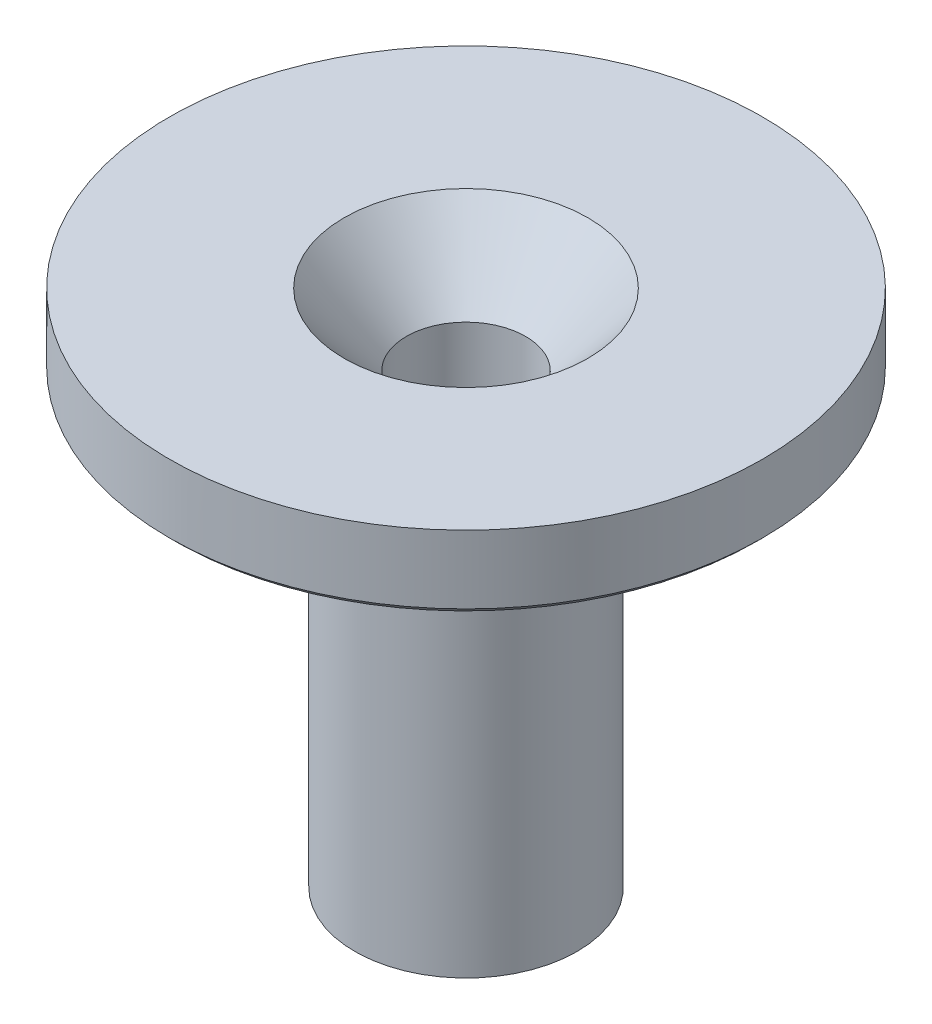
ISO-10303-21;
HEADER;
FILE_DESCRIPTION(('STEP AP214'),'2;1');
FILE_NAME('part.step','',(''),(''),'','','');
FILE_SCHEMA(('AUTOMOTIVE_DESIGN { 1 0 10303 214 1 1 1 1 }'));
ENDSEC;
DATA;
#1=APPLICATION_CONTEXT('core data for automotive mechanical design processes');
#2=APPLICATION_PROTOCOL_DEFINITION('international standard','automotive_design',2000,#1);
#3=PRODUCT_CONTEXT('',#1,'mechanical');
#4=PRODUCT('Part','Part','',(#3));
#5=PRODUCT_RELATED_PRODUCT_CATEGORY('part','',(#4));
#6=PRODUCT_DEFINITION_FORMATION('','',#4);
#7=PRODUCT_DEFINITION_CONTEXT('part definition',#1,'design');
#8=PRODUCT_DEFINITION('design','',#6,#7);
#9=PRODUCT_DEFINITION_SHAPE('','',#8);
#10=(LENGTH_UNIT() NAMED_UNIT(*) SI_UNIT(.MILLI.,.METRE.));
#11=(NAMED_UNIT(*) PLANE_ANGLE_UNIT() SI_UNIT($,.RADIAN.));
#12=(NAMED_UNIT(*) SI_UNIT($,.STERADIAN.) SOLID_ANGLE_UNIT());
#13=UNCERTAINTY_MEASURE_WITH_UNIT(LENGTH_MEASURE(1.E-05),#10,'distance_accuracy_value','');
#14=(GEOMETRIC_REPRESENTATION_CONTEXT(3) GLOBAL_UNCERTAINTY_ASSIGNED_CONTEXT((#13)) GLOBAL_UNIT_ASSIGNED_CONTEXT((#10,
#11,#12)) REPRESENTATION_CONTEXT('',''));
#15=CARTESIAN_POINT('',(0.,0.,0.));
#16=DIRECTION('',(0.,0.,1.));
#17=DIRECTION('',(1.,0.,0.));
#18=AXIS2_PLACEMENT_3D('',#15,#16,#17);
#19=CARTESIAN_POINT('',(0.,10.1404936145992,0.));
#20=DIRECTION('',(0.,-1.,0.));
#21=DIRECTION('',(1.,0.,0.));
#22=AXIS2_PLACEMENT_3D('',#19,#20,#21);
#23=PLANE('',#22);
#24=CARTESIAN_POINT('',(0.,10.1404936145992,0.));
#25=DIRECTION('',(0.,1.,0.));
#26=DIRECTION('',(0.,0.,1.));
#27=AXIS2_PLACEMENT_3D('',#24,#25,#26);
#28=CIRCLE('',#27,5.2197);
#29=CARTESIAN_POINT('',(0.,10.1404936145992,5.2197));
#30=VERTEX_POINT('',#29);
#31=EDGE_CURVE('E60',#30,#30,#28,.T.);
#32=ORIENTED_EDGE('',*,*,#31,.F.);
#33=EDGE_LOOP('',(#32));
#34=FACE_BOUND('',#33,.T.);
#35=CARTESIAN_POINT('',(0.,10.1404936145992,0.));
#36=DIRECTION('',(0.,-1.,0.));
#37=DIRECTION('',(1.,0.,0.));
#38=AXIS2_PLACEMENT_3D('',#35,#36,#37);
#39=CIRCLE('',#38,12.7);
#40=CARTESIAN_POINT('',(12.7,10.1404936145992,0.));
#41=VERTEX_POINT('',#40);
#42=EDGE_CURVE('E42',#41,#41,#39,.T.);
#43=ORIENTED_EDGE('',*,*,#42,.F.);
#44=EDGE_LOOP('',(#43));
#45=FACE_BOUND('',#44,.T.);
#46=ADVANCED_FACE('F31',(#34,#45),#23,.F.);
#47=CARTESIAN_POINT('',(0.,-12.0845063854008,0.));
#48=DIRECTION('',(0.,-1.,0.));
#49=DIRECTION('',(1.,0.,0.));
#50=AXIS2_PLACEMENT_3D('',#47,#48,#49);
#51=CYLINDRICAL_SURFACE('',#50,12.7);
#52=CARTESIAN_POINT('',(0.,7.21949361459922,0.));
#53=DIRECTION('',(0.,1.,0.));
#54=DIRECTION('',(-1.,0.,0.));
#55=AXIS2_PLACEMENT_3D('',#52,#53,#54);
#56=CIRCLE('',#55,12.7);
#57=CARTESIAN_POINT('',(-12.7,7.21949361459922,0.));
#58=VERTEX_POINT('',#57);
#59=EDGE_CURVE('E10',#58,#58,#56,.T.);
#60=ORIENTED_EDGE('',*,*,#59,.T.);
#61=EDGE_LOOP('',(#60));
#62=FACE_BOUND('',#61,.T.);
#63=ORIENTED_EDGE('',*,*,#42,.T.);
#64=EDGE_LOOP('',(#63));
#65=FACE_BOUND('',#64,.T.);
#66=ADVANCED_FACE('F68',(#62,#65),#51,.T.);
#67=CARTESIAN_POINT('',(-12.7,6.96549361459922,0.));
#68=DIRECTION('',(0.,1.,0.));
#69=DIRECTION('',(-1.,0.,0.));
#70=AXIS2_PLACEMENT_3D('',#67,#68,#69);
#71=PLANE('',#70);
#72=CARTESIAN_POINT('',(0.,6.96549361459922,0.));
#73=DIRECTION('',(0.,1.,0.));
#74=DIRECTION('',(-1.,0.,0.));
#75=AXIS2_PLACEMENT_3D('',#72,#73,#74);
#76=CIRCLE('',#75,12.446);
#77=CARTESIAN_POINT('',(-12.446,6.96549361459922,0.));
#78=VERTEX_POINT('',#77);
#79=EDGE_CURVE('E38',#78,#78,#76,.F.);
#80=ORIENTED_EDGE('',*,*,#79,.T.);
#81=EDGE_LOOP('',(#80));
#82=FACE_BOUND('',#81,.T.);
#83=CARTESIAN_POINT('',(0.,6.96549361459923,0.));
#84=DIRECTION('',(0.,-1.,0.));
#85=DIRECTION('',(1.,0.,0.));
#86=AXIS2_PLACEMENT_3D('',#83,#84,#85);
#87=CIRCLE('',#86,4.7625);
#88=CARTESIAN_POINT('',(4.7625,6.96549361459923,0.));
#89=VERTEX_POINT('',#88);
#90=EDGE_CURVE('E46',#89,#89,#87,.T.);
#91=ORIENTED_EDGE('',*,*,#90,.F.);
#92=EDGE_LOOP('',(#91));
#93=FACE_BOUND('',#92,.T.);
#94=ADVANCED_FACE('F72',(#82,#93),#71,.F.);
#95=CARTESIAN_POINT('',(0.,-12.0845063854008,0.));
#96=DIRECTION('',(0.,-1.,0.));
#97=DIRECTION('',(1.,0.,0.));
#98=AXIS2_PLACEMENT_3D('',#95,#96,#97);
#99=CYLINDRICAL_SURFACE('',#98,4.7625);
#100=CARTESIAN_POINT('',(0.,-12.0845063854008,0.));
#101=DIRECTION('',(0.,-1.,0.));
#102=DIRECTION('',(1.,0.,0.));
#103=AXIS2_PLACEMENT_3D('',#100,#101,#102);
#104=CIRCLE('',#103,4.7625);
#105=CARTESIAN_POINT('',(4.76249999999999,-12.0845063854008,0.));
#106=VERTEX_POINT('',#105);
#107=EDGE_CURVE('E51',#106,#106,#104,.T.);
#108=ORIENTED_EDGE('',*,*,#107,.F.);
#109=EDGE_LOOP('',(#108));
#110=FACE_BOUND('',#109,.T.);
#111=ORIENTED_EDGE('',*,*,#90,.T.);
#112=EDGE_LOOP('',(#111));
#113=FACE_BOUND('',#112,.T.);
#114=ADVANCED_FACE('F77',(#110,#113),#99,.T.);
#115=CARTESIAN_POINT('',(-4.7625,-12.0845063854008,0.));
#116=DIRECTION('',(0.,1.,0.));
#117=DIRECTION('',(-1.,0.,0.));
#118=AXIS2_PLACEMENT_3D('',#115,#116,#117);
#119=PLANE('',#118);
#120=CARTESIAN_POINT('',(0.,-12.0845063854008,0.));
#121=DIRECTION('',(0.,1.,0.));
#122=DIRECTION('',(0.,0.,1.));
#123=AXIS2_PLACEMENT_3D('',#120,#121,#122);
#124=CIRCLE('',#123,2.5527);
#125=CARTESIAN_POINT('',(0.,-12.0845063854008,2.5527));
#126=VERTEX_POINT('',#125);
#127=EDGE_CURVE('E54',#126,#126,#124,.T.);
#128=ORIENTED_EDGE('',*,*,#127,.T.);
#129=EDGE_LOOP('',(#128));
#130=FACE_BOUND('',#129,.T.);
#131=ORIENTED_EDGE('',*,*,#107,.T.);
#132=EDGE_LOOP('',(#131));
#133=FACE_BOUND('',#132,.T.);
#134=ADVANCED_FACE('F82',(#130,#133),#119,.F.);
#135=CARTESIAN_POINT('',(0.,10.1404936145992,0.));
#136=DIRECTION('',(0.,1.,0.));
#137=DIRECTION('',(0.,0.,1.));
#138=AXIS2_PLACEMENT_3D('',#135,#136,#137);
#139=CYLINDRICAL_SURFACE('',#138,2.5527);
#140=ORIENTED_EDGE('',*,*,#127,.F.);
#141=EDGE_LOOP('',(#140));
#142=FACE_BOUND('',#141,.T.);
#143=CARTESIAN_POINT('',(0.,7.07246107254079,0.));
#144=DIRECTION('',(0.,1.,0.));
#145=DIRECTION('',(0.,0.,1.));
#146=AXIS2_PLACEMENT_3D('',#143,#144,#145);
#147=CIRCLE('',#146,2.5527);
#148=CARTESIAN_POINT('',(0.,7.07246107254079,2.5527));
#149=VERTEX_POINT('',#148);
#150=EDGE_CURVE('E57',#149,#149,#147,.T.);
#151=ORIENTED_EDGE('',*,*,#150,.T.);
#152=EDGE_LOOP('',(#151));
#153=FACE_BOUND('',#152,.T.);
#154=ADVANCED_FACE('F86',(#142,#153),#139,.F.);
#155=CARTESIAN_POINT('',(0.,10.1404936145992,0.));
#156=DIRECTION('',(0.,1.,0.));
#157=DIRECTION('',(0.,0.,1.));
#158=AXIS2_PLACEMENT_3D('',#155,#156,#157);
#159=CONICAL_SURFACE('',#158,5.2197,0.715584993317675);
#160=ORIENTED_EDGE('',*,*,#150,.F.);
#161=EDGE_LOOP('',(#160));
#162=FACE_BOUND('',#161,.T.);
#163=ORIENTED_EDGE('',*,*,#31,.T.);
#164=EDGE_LOOP('',(#163));
#165=FACE_BOUND('',#164,.T.);
#166=ADVANCED_FACE('F64',(#162,#165),#159,.F.);
#167=CARTESIAN_POINT('',(0.,6.96549361459922,0.));
#168=DIRECTION('',(0.,1.,0.));
#169=DIRECTION('',(-1.,0.,0.));
#170=AXIS2_PLACEMENT_3D('',#167,#168,#169);
#171=CONICAL_SURFACE('',#170,12.446,0.785398163397431);
#172=ORIENTED_EDGE('',*,*,#59,.F.);
#173=EDGE_LOOP('',(#172));
#174=FACE_BOUND('',#173,.T.);
#175=ORIENTED_EDGE('',*,*,#79,.F.);
#176=EDGE_LOOP('',(#175));
#177=FACE_BOUND('',#176,.T.);
#178=ADVANCED_FACE('F33',(#174,#177),#171,.T.);
#179=CLOSED_SHELL('',(#46,#66,#94,#114,#134,#154,#166,#178));
#180=MANIFOLD_SOLID_BREP('B2',#179);
#181=ADVANCED_BREP_SHAPE_REPRESENTATION('',(#18,#180),#14);
#182=SHAPE_DEFINITION_REPRESENTATION(#9,#181);
ENDSEC;
END-ISO-10303-21;
